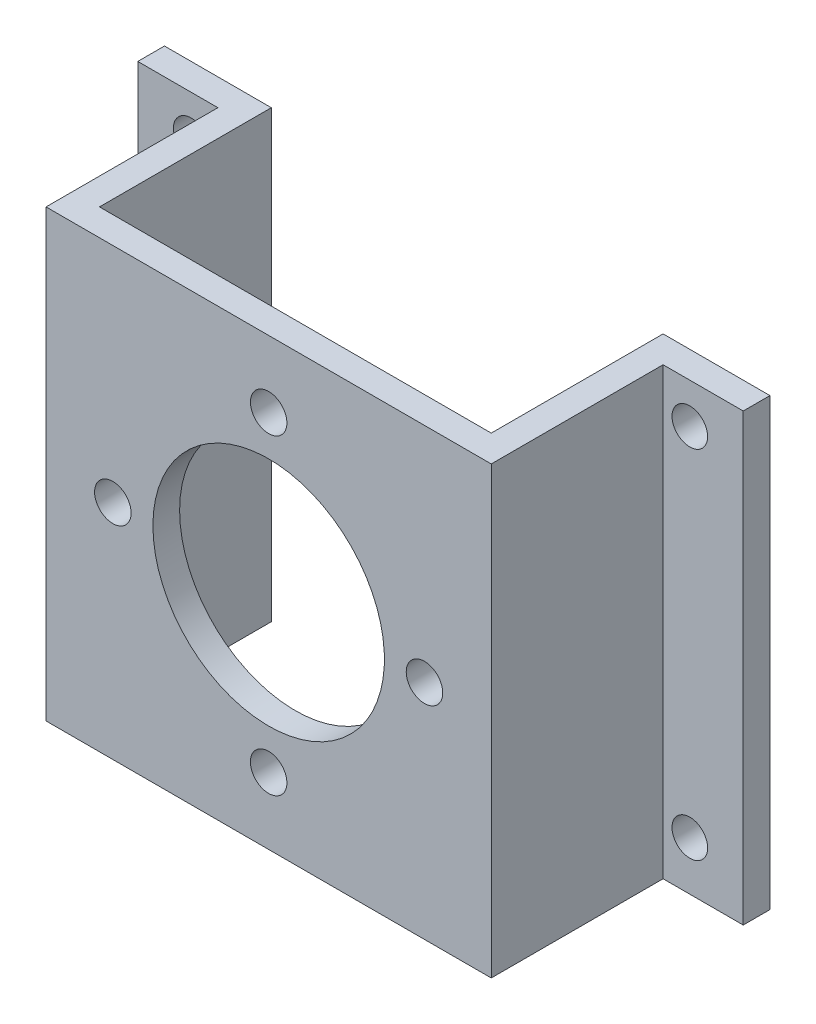
ISO-10303-21;
HEADER;
FILE_DESCRIPTION(('STEP AP214'),'2;1');
FILE_NAME('part.step','',(''),(''),'','','');
FILE_SCHEMA(('AUTOMOTIVE_DESIGN { 1 0 10303 214 1 1 1 1 }'));
ENDSEC;
DATA;
#1=APPLICATION_CONTEXT('core data for automotive mechanical design processes');
#2=APPLICATION_PROTOCOL_DEFINITION('international standard','automotive_design',2000,#1);
#3=PRODUCT_CONTEXT('',#1,'mechanical');
#4=PRODUCT('Part','Part','',(#3));
#5=PRODUCT_RELATED_PRODUCT_CATEGORY('part','',(#4));
#6=PRODUCT_DEFINITION_FORMATION('','',#4);
#7=PRODUCT_DEFINITION_CONTEXT('part definition',#1,'design');
#8=PRODUCT_DEFINITION('design','',#6,#7);
#9=PRODUCT_DEFINITION_SHAPE('','',#8);
#10=(LENGTH_UNIT() NAMED_UNIT(*) SI_UNIT(.MILLI.,.METRE.));
#11=(NAMED_UNIT(*) PLANE_ANGLE_UNIT() SI_UNIT($,.RADIAN.));
#12=(NAMED_UNIT(*) SI_UNIT($,.STERADIAN.) SOLID_ANGLE_UNIT());
#13=UNCERTAINTY_MEASURE_WITH_UNIT(LENGTH_MEASURE(1.E-05),#10,'distance_accuracy_value','');
#14=(GEOMETRIC_REPRESENTATION_CONTEXT(3) GLOBAL_UNCERTAINTY_ASSIGNED_CONTEXT((#13)) GLOBAL_UNIT_ASSIGNED_CONTEXT((#10,
#11,#12)) REPRESENTATION_CONTEXT('',''));
#15=CARTESIAN_POINT('',(0.,0.,0.));
#16=DIRECTION('',(0.,0.,1.));
#17=DIRECTION('',(1.,0.,0.));
#18=AXIS2_PLACEMENT_3D('',#15,#16,#17);
#19=CARTESIAN_POINT('',(-34.,25.,-19.3));
#20=DIRECTION('',(0.,0.,1.));
#21=DIRECTION('',(-1.,0.,0.));
#22=AXIS2_PLACEMENT_3D('',#19,#20,#21);
#23=PLANE('',#22);
#24=CARTESIAN_POINT('',(-28.0000000000001,-19.5,-19.3));
#25=DIRECTION('',(0.,0.,-1.));
#26=DIRECTION('',(-1.,0.,0.));
#27=AXIS2_PLACEMENT_3D('',#24,#25,#26);
#28=CIRCLE('',#27,2.00000000000001);
#29=CARTESIAN_POINT('',(-30.0000000000001,-19.5,-19.3));
#30=VERTEX_POINT('',#29);
#31=EDGE_CURVE('E275',#30,#30,#28,.T.);
#32=ORIENTED_EDGE('',*,*,#31,.F.);
#33=EDGE_LOOP('',(#32));
#34=FACE_BOUND('',#33,.T.);
#35=CARTESIAN_POINT('',(-28.0000000000001,20.5,-19.3));
#36=DIRECTION('',(0.,0.,-1.));
#37=DIRECTION('',(-1.,0.,0.));
#38=AXIS2_PLACEMENT_3D('',#35,#36,#37);
#39=CIRCLE('',#38,2.);
#40=CARTESIAN_POINT('',(-30.0000000000001,20.5,-19.3));
#41=VERTEX_POINT('',#40);
#42=EDGE_CURVE('E278',#41,#41,#39,.T.);
#43=ORIENTED_EDGE('',*,*,#42,.F.);
#44=EDGE_LOOP('',(#43));
#45=FACE_BOUND('',#44,.T.);
#46=DIRECTION('',(1.,0.,0.));
#47=VECTOR('',#46,1.);
#48=CARTESIAN_POINT('',(-34.,-25.,-19.3));
#49=LINE('',#48,#47);
#50=CARTESIAN_POINT('',(-34.,-25.,-19.3));
#51=VERTEX_POINT('',#50);
#52=CARTESIAN_POINT('',(-22.,-25.,-19.3));
#53=VERTEX_POINT('',#52);
#54=EDGE_CURVE('E157',#51,#53,#49,.T.);
#55=ORIENTED_EDGE('',*,*,#54,.F.);
#56=DIRECTION('',(0.,-1.,0.));
#57=VECTOR('',#56,1.);
#58=CARTESIAN_POINT('',(-34.,25.,-19.3));
#59=LINE('',#58,#57);
#60=CARTESIAN_POINT('',(-34.,25.,-19.3));
#61=VERTEX_POINT('',#60);
#62=EDGE_CURVE('E156',#61,#51,#59,.T.);
#63=ORIENTED_EDGE('',*,*,#62,.F.);
#64=DIRECTION('',(1.,0.,0.));
#65=VECTOR('',#64,1.);
#66=CARTESIAN_POINT('',(-34.,25.,-19.3));
#67=LINE('',#66,#65);
#68=CARTESIAN_POINT('',(-22.,25.,-19.3));
#69=VERTEX_POINT('',#68);
#70=EDGE_CURVE('E188',#61,#69,#67,.T.);
#71=ORIENTED_EDGE('',*,*,#70,.T.);
#72=DIRECTION('',(0.,-1.,0.));
#73=VECTOR('',#72,1.);
#74=CARTESIAN_POINT('',(-22.,25.,-19.3));
#75=LINE('',#74,#73);
#76=EDGE_CURVE('E11',#69,#53,#75,.T.);
#77=ORIENTED_EDGE('',*,*,#76,.T.);
#78=EDGE_LOOP('',(#55,#63,#71,#77));
#79=FACE_BOUND('',#78,.T.);
#80=ADVANCED_FACE('F37',(#34,#45,#79),#23,.F.);
#81=CARTESIAN_POINT('',(-22.,25.,-19.3));
#82=DIRECTION('',(-1.,0.,0.));
#83=DIRECTION('',(0.,0.,-1.));
#84=AXIS2_PLACEMENT_3D('',#81,#82,#83);
#85=PLANE('',#84);
#86=DIRECTION('',(0.,0.,1.));
#87=VECTOR('',#86,1.);
#88=CARTESIAN_POINT('',(-22.,-25.,-19.3));
#89=LINE('',#88,#87);
#90=CARTESIAN_POINT('',(-22.,-25.,0.));
#91=VERTEX_POINT('',#90);
#92=EDGE_CURVE('E159',#53,#91,#89,.T.);
#93=ORIENTED_EDGE('',*,*,#92,.F.);
#94=ORIENTED_EDGE('',*,*,#76,.F.);
#95=DIRECTION('',(0.,0.,1.));
#96=VECTOR('',#95,1.);
#97=CARTESIAN_POINT('',(-22.,25.,-19.3));
#98=LINE('',#97,#96);
#99=CARTESIAN_POINT('',(-22.,25.,0.));
#100=VERTEX_POINT('',#99);
#101=EDGE_CURVE('E103',#69,#100,#98,.T.);
#102=ORIENTED_EDGE('',*,*,#101,.T.);
#103=DIRECTION('',(0.,-1.,0.));
#104=VECTOR('',#103,1.);
#105=CARTESIAN_POINT('',(-22.,25.,0.));
#106=LINE('',#105,#104);
#107=EDGE_CURVE('E45',#100,#91,#106,.T.);
#108=ORIENTED_EDGE('',*,*,#107,.T.);
#109=EDGE_LOOP('',(#93,#94,#102,#108));
#110=FACE_BOUND('',#109,.T.);
#111=ADVANCED_FACE('F212',(#110),#85,.F.);
#112=CARTESIAN_POINT('',(-22.,25.,0.));
#113=DIRECTION('',(0.,0.,1.));
#114=DIRECTION('',(-1.,0.,0.));
#115=AXIS2_PLACEMENT_3D('',#112,#113,#114);
#116=PLANE('',#115);
#117=CARTESIAN_POINT('',(0.,-17.5,0.));
#118=DIRECTION('',(0.,0.,-1.));
#119=DIRECTION('',(-1.,0.,0.));
#120=AXIS2_PLACEMENT_3D('',#117,#118,#119);
#121=CIRCLE('',#120,2.05);
#122=CARTESIAN_POINT('',(-2.05,-17.5,0.));
#123=VERTEX_POINT('',#122);
#124=EDGE_CURVE('E308',#123,#123,#121,.T.);
#125=ORIENTED_EDGE('',*,*,#124,.F.);
#126=EDGE_LOOP('',(#125));
#127=FACE_BOUND('',#126,.T.);
#128=CARTESIAN_POINT('',(-17.5,0.,0.));
#129=DIRECTION('',(0.,0.,-1.));
#130=DIRECTION('',(-1.,0.,0.));
#131=AXIS2_PLACEMENT_3D('',#128,#129,#130);
#132=CIRCLE('',#131,2.05);
#133=CARTESIAN_POINT('',(-19.55,0.,0.));
#134=VERTEX_POINT('',#133);
#135=EDGE_CURVE('E305',#134,#134,#132,.T.);
#136=ORIENTED_EDGE('',*,*,#135,.F.);
#137=EDGE_LOOP('',(#136));
#138=FACE_BOUND('',#137,.T.);
#139=CARTESIAN_POINT('',(17.5,0.,0.));
#140=DIRECTION('',(0.,0.,-1.));
#141=DIRECTION('',(-1.,0.,0.));
#142=AXIS2_PLACEMENT_3D('',#139,#140,#141);
#143=CIRCLE('',#142,2.05);
#144=CARTESIAN_POINT('',(15.45,0.,0.));
#145=VERTEX_POINT('',#144);
#146=EDGE_CURVE('E302',#145,#145,#143,.T.);
#147=ORIENTED_EDGE('',*,*,#146,.F.);
#148=EDGE_LOOP('',(#147));
#149=FACE_BOUND('',#148,.T.);
#150=CARTESIAN_POINT('',(0.,17.5,0.));
#151=DIRECTION('',(0.,0.,-1.));
#152=DIRECTION('',(-1.,0.,0.));
#153=AXIS2_PLACEMENT_3D('',#150,#151,#152);
#154=CIRCLE('',#153,2.05);
#155=CARTESIAN_POINT('',(-2.05,17.5,0.));
#156=VERTEX_POINT('',#155);
#157=EDGE_CURVE('E297',#156,#156,#154,.T.);
#158=ORIENTED_EDGE('',*,*,#157,.F.);
#159=EDGE_LOOP('',(#158));
#160=FACE_BOUND('',#159,.T.);
#161=CARTESIAN_POINT('',(0.,0.,0.));
#162=DIRECTION('',(0.,0.,-1.));
#163=DIRECTION('',(-1.,0.,0.));
#164=AXIS2_PLACEMENT_3D('',#161,#162,#163);
#165=CIRCLE('',#164,13.);
#166=CARTESIAN_POINT('',(-13.,0.,0.));
#167=VERTEX_POINT('',#166);
#168=EDGE_CURVE('E160',#167,#167,#165,.T.);
#169=ORIENTED_EDGE('',*,*,#168,.F.);
#170=EDGE_LOOP('',(#169));
#171=FACE_BOUND('',#170,.T.);
#172=DIRECTION('',(1.,0.,0.));
#173=VECTOR('',#172,1.);
#174=CARTESIAN_POINT('',(-22.,-25.,0.));
#175=LINE('',#174,#173);
#176=CARTESIAN_POINT('',(22.,-25.,0.));
#177=VERTEX_POINT('',#176);
#178=EDGE_CURVE('E163',#91,#177,#175,.T.);
#179=ORIENTED_EDGE('',*,*,#178,.F.);
#180=ORIENTED_EDGE('',*,*,#107,.F.);
#181=DIRECTION('',(1.,0.,0.));
#182=VECTOR('',#181,1.);
#183=CARTESIAN_POINT('',(-22.,25.,0.));
#184=LINE('',#183,#182);
#185=CARTESIAN_POINT('',(22.,25.,0.));
#186=VERTEX_POINT('',#185);
#187=EDGE_CURVE('E221',#100,#186,#184,.T.);
#188=ORIENTED_EDGE('',*,*,#187,.T.);
#189=DIRECTION('',(0.,-1.,0.));
#190=VECTOR('',#189,1.);
#191=CARTESIAN_POINT('',(22.,25.,0.));
#192=LINE('',#191,#190);
#193=EDGE_CURVE('E207',#186,#177,#192,.T.);
#194=ORIENTED_EDGE('',*,*,#193,.T.);
#195=EDGE_LOOP('',(#179,#180,#188,#194));
#196=FACE_BOUND('',#195,.T.);
#197=ADVANCED_FACE('F257',(#127,#138,#149,#160,#171,#196),#116,.F.);
#198=CARTESIAN_POINT('',(22.,25.,0.));
#199=DIRECTION('',(1.,0.,0.));
#200=DIRECTION('',(0.,0.,1.));
#201=AXIS2_PLACEMENT_3D('',#198,#199,#200);
#202=PLANE('',#201);
#203=DIRECTION('',(0.,0.,-1.));
#204=VECTOR('',#203,1.);
#205=CARTESIAN_POINT('',(22.,-25.,0.));
#206=LINE('',#205,#204);
#207=CARTESIAN_POINT('',(22.,-25.,-19.3));
#208=VERTEX_POINT('',#207);
#209=EDGE_CURVE('E166',#177,#208,#206,.T.);
#210=ORIENTED_EDGE('',*,*,#209,.F.);
#211=ORIENTED_EDGE('',*,*,#193,.F.);
#212=DIRECTION('',(0.,0.,-1.));
#213=VECTOR('',#212,1.);
#214=CARTESIAN_POINT('',(22.,25.,0.));
#215=LINE('',#214,#213);
#216=CARTESIAN_POINT('',(22.,25.,-19.3));
#217=VERTEX_POINT('',#216);
#218=EDGE_CURVE('E227',#186,#217,#215,.T.);
#219=ORIENTED_EDGE('',*,*,#218,.T.);
#220=DIRECTION('',(0.,-1.,0.));
#221=VECTOR('',#220,1.);
#222=CARTESIAN_POINT('',(22.,25.,-19.3));
#223=LINE('',#222,#221);
#224=EDGE_CURVE('E204',#217,#208,#223,.T.);
#225=ORIENTED_EDGE('',*,*,#224,.T.);
#226=EDGE_LOOP('',(#210,#211,#219,#225));
#227=FACE_BOUND('',#226,.T.);
#228=ADVANCED_FACE('F256',(#227),#202,.F.);
#229=CARTESIAN_POINT('',(22.,25.,-19.3));
#230=DIRECTION('',(0.,0.,1.));
#231=DIRECTION('',(-1.,0.,0.));
#232=AXIS2_PLACEMENT_3D('',#229,#230,#231);
#233=PLANE('',#232);
#234=CARTESIAN_POINT('',(27.9999999999999,20.5,-19.3));
#235=DIRECTION('',(0.,0.,-1.));
#236=DIRECTION('',(-1.,0.,0.));
#237=AXIS2_PLACEMENT_3D('',#234,#235,#236);
#238=CIRCLE('',#237,2.);
#239=CARTESIAN_POINT('',(25.9999999999999,20.5,-19.3));
#240=VERTEX_POINT('',#239);
#241=EDGE_CURVE('E287',#240,#240,#238,.T.);
#242=ORIENTED_EDGE('',*,*,#241,.F.);
#243=EDGE_LOOP('',(#242));
#244=FACE_BOUND('',#243,.T.);
#245=CARTESIAN_POINT('',(27.9999999999999,-19.5,-19.3));
#246=DIRECTION('',(0.,0.,-1.));
#247=DIRECTION('',(-1.,0.,0.));
#248=AXIS2_PLACEMENT_3D('',#245,#246,#247);
#249=CIRCLE('',#248,2.00000000000001);
#250=CARTESIAN_POINT('',(25.9999999999999,-19.5,-19.3));
#251=VERTEX_POINT('',#250);
#252=EDGE_CURVE('E362',#251,#251,#249,.T.);
#253=ORIENTED_EDGE('',*,*,#252,.F.);
#254=EDGE_LOOP('',(#253));
#255=FACE_BOUND('',#254,.T.);
#256=DIRECTION('',(1.,0.,0.));
#257=VECTOR('',#256,1.);
#258=CARTESIAN_POINT('',(22.,-25.,-19.3));
#259=LINE('',#258,#257);
#260=CARTESIAN_POINT('',(34.,-25.,-19.3));
#261=VERTEX_POINT('',#260);
#262=EDGE_CURVE('E169',#208,#261,#259,.T.);
#263=ORIENTED_EDGE('',*,*,#262,.F.);
#264=ORIENTED_EDGE('',*,*,#224,.F.);
#265=DIRECTION('',(1.,0.,0.));
#266=VECTOR('',#265,1.);
#267=CARTESIAN_POINT('',(22.,25.,-19.3));
#268=LINE('',#267,#266);
#269=CARTESIAN_POINT('',(34.,25.,-19.3));
#270=VERTEX_POINT('',#269);
#271=EDGE_CURVE('E230',#217,#270,#268,.T.);
#272=ORIENTED_EDGE('',*,*,#271,.T.);
#273=DIRECTION('',(0.,-1.,0.));
#274=VECTOR('',#273,1.);
#275=CARTESIAN_POINT('',(34.,25.,-19.3));
#276=LINE('',#275,#274);
#277=EDGE_CURVE('E201',#270,#261,#276,.T.);
#278=ORIENTED_EDGE('',*,*,#277,.T.);
#279=EDGE_LOOP('',(#263,#264,#272,#278));
#280=FACE_BOUND('',#279,.T.);
#281=ADVANCED_FACE('F254',(#244,#255,#280),#233,.F.);
#282=CARTESIAN_POINT('',(34.,25.,-16.3));
#283=DIRECTION('',(-1.,0.,0.));
#284=DIRECTION('',(0.,0.,-1.));
#285=AXIS2_PLACEMENT_3D('',#282,#283,#284);
#286=PLANE('',#285);
#287=DIRECTION('',(0.,0.,1.));
#288=VECTOR('',#287,1.);
#289=CARTESIAN_POINT('',(34.,-25.,-16.3));
#290=LINE('',#289,#288);
#291=CARTESIAN_POINT('',(34.,-25.,-16.3));
#292=VERTEX_POINT('',#291);
#293=EDGE_CURVE('E172',#261,#292,#290,.T.);
#294=ORIENTED_EDGE('',*,*,#293,.F.);
#295=ORIENTED_EDGE('',*,*,#277,.F.);
#296=DIRECTION('',(0.,0.,1.));
#297=VECTOR('',#296,1.);
#298=CARTESIAN_POINT('',(34.,25.,-16.3));
#299=LINE('',#298,#297);
#300=CARTESIAN_POINT('',(34.,25.,-16.3));
#301=VERTEX_POINT('',#300);
#302=EDGE_CURVE('E233',#270,#301,#299,.T.);
#303=ORIENTED_EDGE('',*,*,#302,.T.);
#304=DIRECTION('',(0.,-1.,0.));
#305=VECTOR('',#304,1.);
#306=CARTESIAN_POINT('',(34.,25.,-16.3));
#307=LINE('',#306,#305);
#308=EDGE_CURVE('E198',#301,#292,#307,.T.);
#309=ORIENTED_EDGE('',*,*,#308,.T.);
#310=EDGE_LOOP('',(#294,#295,#303,#309));
#311=FACE_BOUND('',#310,.T.);
#312=ADVANCED_FACE('F250',(#311),#286,.F.);
#313=CARTESIAN_POINT('',(25.,25.,-16.3));
#314=DIRECTION('',(0.,0.,-1.));
#315=DIRECTION('',(1.,0.,0.));
#316=AXIS2_PLACEMENT_3D('',#313,#314,#315);
#317=PLANE('',#316);
#318=CARTESIAN_POINT('',(27.9999999999999,20.5,-16.3));
#319=DIRECTION('',(0.,0.,-1.));
#320=DIRECTION('',(-1.,0.,0.));
#321=AXIS2_PLACEMENT_3D('',#318,#319,#320);
#322=CIRCLE('',#321,2.);
#323=CARTESIAN_POINT('',(25.9999999999999,20.5,-16.3));
#324=VERTEX_POINT('',#323);
#325=EDGE_CURVE('E371',#324,#324,#322,.T.);
#326=ORIENTED_EDGE('',*,*,#325,.T.);
#327=EDGE_LOOP('',(#326));
#328=FACE_BOUND('',#327,.T.);
#329=CARTESIAN_POINT('',(27.9999999999999,-19.5,-16.3));
#330=DIRECTION('',(0.,0.,-1.));
#331=DIRECTION('',(-1.,0.,0.));
#332=AXIS2_PLACEMENT_3D('',#329,#330,#331);
#333=CIRCLE('',#332,2.00000000000001);
#334=CARTESIAN_POINT('',(25.9999999999999,-19.5,-16.3));
#335=VERTEX_POINT('',#334);
#336=EDGE_CURVE('E368',#335,#335,#333,.T.);
#337=ORIENTED_EDGE('',*,*,#336,.T.);
#338=EDGE_LOOP('',(#337));
#339=FACE_BOUND('',#338,.T.);
#340=DIRECTION('',(-1.,0.,0.));
#341=VECTOR('',#340,1.);
#342=CARTESIAN_POINT('',(25.,-25.,-16.3));
#343=LINE('',#342,#341);
#344=CARTESIAN_POINT('',(25.,-25.,-16.3));
#345=VERTEX_POINT('',#344);
#346=EDGE_CURVE('E175',#292,#345,#343,.T.);
#347=ORIENTED_EDGE('',*,*,#346,.F.);
#348=ORIENTED_EDGE('',*,*,#308,.F.);
#349=DIRECTION('',(-1.,0.,0.));
#350=VECTOR('',#349,1.);
#351=CARTESIAN_POINT('',(25.,25.,-16.3));
#352=LINE('',#351,#350);
#353=CARTESIAN_POINT('',(25.,25.,-16.3));
#354=VERTEX_POINT('',#353);
#355=EDGE_CURVE('E236',#301,#354,#352,.T.);
#356=ORIENTED_EDGE('',*,*,#355,.T.);
#357=DIRECTION('',(0.,-1.,0.));
#358=VECTOR('',#357,1.);
#359=CARTESIAN_POINT('',(25.,25.,-16.3));
#360=LINE('',#359,#358);
#361=EDGE_CURVE('E195',#354,#345,#360,.T.);
#362=ORIENTED_EDGE('',*,*,#361,.T.);
#363=EDGE_LOOP('',(#347,#348,#356,#362));
#364=FACE_BOUND('',#363,.T.);
#365=ADVANCED_FACE('F247',(#328,#339,#364),#317,.F.);
#366=CARTESIAN_POINT('',(25.,25.,3.));
#367=DIRECTION('',(-1.,0.,0.));
#368=DIRECTION('',(0.,0.,-1.));
#369=AXIS2_PLACEMENT_3D('',#366,#367,#368);
#370=PLANE('',#369);
#371=DIRECTION('',(0.,0.,1.));
#372=VECTOR('',#371,1.);
#373=CARTESIAN_POINT('',(25.,-25.,3.));
#374=LINE('',#373,#372);
#375=CARTESIAN_POINT('',(25.,-25.,3.));
#376=VERTEX_POINT('',#375);
#377=EDGE_CURVE('E178',#345,#376,#374,.T.);
#378=ORIENTED_EDGE('',*,*,#377,.F.);
#379=ORIENTED_EDGE('',*,*,#361,.F.);
#380=DIRECTION('',(0.,0.,1.));
#381=VECTOR('',#380,1.);
#382=CARTESIAN_POINT('',(25.,25.,3.));
#383=LINE('',#382,#381);
#384=CARTESIAN_POINT('',(25.,25.,3.));
#385=VERTEX_POINT('',#384);
#386=EDGE_CURVE('E151',#354,#385,#383,.T.);
#387=ORIENTED_EDGE('',*,*,#386,.T.);
#388=DIRECTION('',(0.,-1.,0.));
#389=VECTOR('',#388,1.);
#390=CARTESIAN_POINT('',(25.,25.,3.));
#391=LINE('',#390,#389);
#392=EDGE_CURVE('E192',#385,#376,#391,.T.);
#393=ORIENTED_EDGE('',*,*,#392,.T.);
#394=EDGE_LOOP('',(#378,#379,#387,#393));
#395=FACE_BOUND('',#394,.T.);
#396=ADVANCED_FACE('F241',(#395),#370,.F.);
#397=CARTESIAN_POINT('',(-25.,25.,3.));
#398=DIRECTION('',(0.,0.,-1.));
#399=DIRECTION('',(1.,0.,0.));
#400=AXIS2_PLACEMENT_3D('',#397,#398,#399);
#401=PLANE('',#400);
#402=CARTESIAN_POINT('',(0.,-17.5,3.));
#403=DIRECTION('',(0.,0.,-1.));
#404=DIRECTION('',(-1.,0.,0.));
#405=AXIS2_PLACEMENT_3D('',#402,#403,#404);
#406=CIRCLE('',#405,2.05);
#407=CARTESIAN_POINT('',(-2.05,-17.5,3.));
#408=VERTEX_POINT('',#407);
#409=EDGE_CURVE('E280',#408,#408,#406,.T.);
#410=ORIENTED_EDGE('',*,*,#409,.T.);
#411=EDGE_LOOP('',(#410));
#412=FACE_BOUND('',#411,.T.);
#413=CARTESIAN_POINT('',(-17.5,0.,3.));
#414=DIRECTION('',(0.,0.,-1.));
#415=DIRECTION('',(-1.,0.,0.));
#416=AXIS2_PLACEMENT_3D('',#413,#414,#415);
#417=CIRCLE('',#416,2.05);
#418=CARTESIAN_POINT('',(-19.55,0.,3.));
#419=VERTEX_POINT('',#418);
#420=EDGE_CURVE('E284',#419,#419,#417,.T.);
#421=ORIENTED_EDGE('',*,*,#420,.T.);
#422=EDGE_LOOP('',(#421));
#423=FACE_BOUND('',#422,.T.);
#424=CARTESIAN_POINT('',(17.5,0.,3.));
#425=DIRECTION('',(0.,0.,-1.));
#426=DIRECTION('',(-1.,0.,0.));
#427=AXIS2_PLACEMENT_3D('',#424,#425,#426);
#428=CIRCLE('',#427,2.05);
#429=CARTESIAN_POINT('',(15.45,0.,3.));
#430=VERTEX_POINT('',#429);
#431=EDGE_CURVE('E292',#430,#430,#428,.T.);
#432=ORIENTED_EDGE('',*,*,#431,.T.);
#433=EDGE_LOOP('',(#432));
#434=FACE_BOUND('',#433,.T.);
#435=CARTESIAN_POINT('',(0.,17.5,3.));
#436=DIRECTION('',(0.,0.,-1.));
#437=DIRECTION('',(-1.,0.,0.));
#438=AXIS2_PLACEMENT_3D('',#435,#436,#437);
#439=CIRCLE('',#438,2.05);
#440=CARTESIAN_POINT('',(-2.05,17.5,3.));
#441=VERTEX_POINT('',#440);
#442=EDGE_CURVE('E294',#441,#441,#439,.T.);
#443=ORIENTED_EDGE('',*,*,#442,.T.);
#444=EDGE_LOOP('',(#443));
#445=FACE_BOUND('',#444,.T.);
#446=CARTESIAN_POINT('',(0.,0.,3.));
#447=DIRECTION('',(0.,0.,-1.));
#448=DIRECTION('',(-1.,0.,0.));
#449=AXIS2_PLACEMENT_3D('',#446,#447,#448);
#450=CIRCLE('',#449,13.);
#451=CARTESIAN_POINT('',(-13.,0.,3.));
#452=VERTEX_POINT('',#451);
#453=EDGE_CURVE('E310',#452,#452,#450,.T.);
#454=ORIENTED_EDGE('',*,*,#453,.T.);
#455=EDGE_LOOP('',(#454));
#456=FACE_BOUND('',#455,.T.);
#457=DIRECTION('',(-1.,0.,0.));
#458=VECTOR('',#457,1.);
#459=CARTESIAN_POINT('',(-25.,-25.,3.));
#460=LINE('',#459,#458);
#461=CARTESIAN_POINT('',(-25.,-25.,3.));
#462=VERTEX_POINT('',#461);
#463=EDGE_CURVE('E181',#376,#462,#460,.T.);
#464=ORIENTED_EDGE('',*,*,#463,.F.);
#465=ORIENTED_EDGE('',*,*,#392,.F.);
#466=DIRECTION('',(-1.,0.,0.));
#467=VECTOR('',#466,1.);
#468=CARTESIAN_POINT('',(-25.,25.,3.));
#469=LINE('',#468,#467);
#470=CARTESIAN_POINT('',(-25.,25.,3.));
#471=VERTEX_POINT('',#470);
#472=EDGE_CURVE('E149',#385,#471,#469,.T.);
#473=ORIENTED_EDGE('',*,*,#472,.T.);
#474=DIRECTION('',(0.,-1.,0.));
#475=VECTOR('',#474,1.);
#476=CARTESIAN_POINT('',(-25.,25.,3.));
#477=LINE('',#476,#475);
#478=EDGE_CURVE('E143',#471,#462,#477,.T.);
#479=ORIENTED_EDGE('',*,*,#478,.T.);
#480=EDGE_LOOP('',(#464,#465,#473,#479));
#481=FACE_BOUND('',#480,.T.);
#482=ADVANCED_FACE('F245',(#412,#423,#434,#445,#456,#481),#401,.F.);
#483=CARTESIAN_POINT('',(-25.,25.,-16.3));
#484=DIRECTION('',(1.,0.,0.));
#485=DIRECTION('',(0.,0.,1.));
#486=AXIS2_PLACEMENT_3D('',#483,#484,#485);
#487=PLANE('',#486);
#488=DIRECTION('',(0.,0.,-1.));
#489=VECTOR('',#488,1.);
#490=CARTESIAN_POINT('',(-25.,-25.,-16.3));
#491=LINE('',#490,#489);
#492=CARTESIAN_POINT('',(-25.,-25.,-16.3));
#493=VERTEX_POINT('',#492);
#494=EDGE_CURVE('E184',#462,#493,#491,.T.);
#495=ORIENTED_EDGE('',*,*,#494,.F.);
#496=ORIENTED_EDGE('',*,*,#478,.F.);
#497=DIRECTION('',(0.,0.,-1.));
#498=VECTOR('',#497,1.);
#499=CARTESIAN_POINT('',(-25.,25.,-16.3));
#500=LINE('',#499,#498);
#501=CARTESIAN_POINT('',(-25.,25.,-16.3));
#502=VERTEX_POINT('',#501);
#503=EDGE_CURVE('E133',#471,#502,#500,.T.);
#504=ORIENTED_EDGE('',*,*,#503,.T.);
#505=DIRECTION('',(0.,-1.,0.));
#506=VECTOR('',#505,1.);
#507=CARTESIAN_POINT('',(-25.,25.,-16.3));
#508=LINE('',#507,#506);
#509=EDGE_CURVE('E138',#502,#493,#508,.T.);
#510=ORIENTED_EDGE('',*,*,#509,.T.);
#511=EDGE_LOOP('',(#495,#496,#504,#510));
#512=FACE_BOUND('',#511,.T.);
#513=ADVANCED_FACE('F146',(#512),#487,.F.);
#514=CARTESIAN_POINT('',(-34.,25.,-16.3));
#515=DIRECTION('',(0.,0.,-1.));
#516=DIRECTION('',(1.,0.,0.));
#517=AXIS2_PLACEMENT_3D('',#514,#515,#516);
#518=PLANE('',#517);
#519=CARTESIAN_POINT('',(-28.0000000000001,-19.5,-16.3));
#520=DIRECTION('',(0.,0.,-1.));
#521=DIRECTION('',(-1.,0.,0.));
#522=AXIS2_PLACEMENT_3D('',#519,#520,#521);
#523=CIRCLE('',#522,2.00000000000001);
#524=CARTESIAN_POINT('',(-30.0000000000001,-19.5,-16.3));
#525=VERTEX_POINT('',#524);
#526=EDGE_CURVE('E365',#525,#525,#523,.T.);
#527=ORIENTED_EDGE('',*,*,#526,.T.);
#528=EDGE_LOOP('',(#527));
#529=FACE_BOUND('',#528,.T.);
#530=CARTESIAN_POINT('',(-28.0000000000001,20.5,-16.3));
#531=DIRECTION('',(0.,0.,-1.));
#532=DIRECTION('',(-1.,0.,0.));
#533=AXIS2_PLACEMENT_3D('',#530,#531,#532);
#534=CIRCLE('',#533,2.);
#535=CARTESIAN_POINT('',(-30.0000000000001,20.5,-16.3));
#536=VERTEX_POINT('',#535);
#537=EDGE_CURVE('E281',#536,#536,#534,.T.);
#538=ORIENTED_EDGE('',*,*,#537,.T.);
#539=EDGE_LOOP('',(#538));
#540=FACE_BOUND('',#539,.T.);
#541=DIRECTION('',(-1.,0.,0.));
#542=VECTOR('',#541,1.);
#543=CARTESIAN_POINT('',(-34.,-25.,-16.3));
#544=LINE('',#543,#542);
#545=CARTESIAN_POINT('',(-34.,-25.,-16.3));
#546=VERTEX_POINT('',#545);
#547=EDGE_CURVE('E140',#493,#546,#544,.T.);
#548=ORIENTED_EDGE('',*,*,#547,.F.);
#549=ORIENTED_EDGE('',*,*,#509,.F.);
#550=DIRECTION('',(-1.,0.,0.));
#551=VECTOR('',#550,1.);
#552=CARTESIAN_POINT('',(-34.,25.,-16.3));
#553=LINE('',#552,#551);
#554=CARTESIAN_POINT('',(-34.,25.,-16.3));
#555=VERTEX_POINT('',#554);
#556=EDGE_CURVE('E129',#502,#555,#553,.T.);
#557=ORIENTED_EDGE('',*,*,#556,.T.);
#558=DIRECTION('',(0.,-1.,0.));
#559=VECTOR('',#558,1.);
#560=CARTESIAN_POINT('',(-34.,25.,-16.3));
#561=LINE('',#560,#559);
#562=EDGE_CURVE('E144',#555,#546,#561,.T.);
#563=ORIENTED_EDGE('',*,*,#562,.T.);
#564=EDGE_LOOP('',(#548,#549,#557,#563));
#565=FACE_BOUND('',#564,.T.);
#566=ADVANCED_FACE('F139',(#529,#540,#565),#518,.F.);
#567=CARTESIAN_POINT('',(-34.,25.,-16.3));
#568=DIRECTION('',(1.,0.,0.));
#569=DIRECTION('',(0.,0.,1.));
#570=AXIS2_PLACEMENT_3D('',#567,#568,#569);
#571=PLANE('',#570);
#572=DIRECTION('',(0.,0.,-1.));
#573=VECTOR('',#572,1.);
#574=CARTESIAN_POINT('',(-34.,-25.,-16.3));
#575=LINE('',#574,#573);
#576=EDGE_CURVE('E91',#546,#51,#575,.T.);
#577=ORIENTED_EDGE('',*,*,#576,.F.);
#578=ORIENTED_EDGE('',*,*,#562,.F.);
#579=DIRECTION('',(0.,0.,-1.));
#580=VECTOR('',#579,1.);
#581=CARTESIAN_POINT('',(-34.,25.,-16.3));
#582=LINE('',#581,#580);
#583=EDGE_CURVE('E53',#555,#61,#582,.T.);
#584=ORIENTED_EDGE('',*,*,#583,.T.);
#585=ORIENTED_EDGE('',*,*,#62,.T.);
#586=EDGE_LOOP('',(#577,#578,#584,#585));
#587=FACE_BOUND('',#586,.T.);
#588=ADVANCED_FACE('F334',(#587),#571,.F.);
#589=CARTESIAN_POINT('',(0.,25.,0.));
#590=DIRECTION('',(0.,1.,0.));
#591=DIRECTION('',(0.,0.,-1.));
#592=AXIS2_PLACEMENT_3D('',#589,#590,#591);
#593=PLANE('',#592);
#594=ORIENTED_EDGE('',*,*,#70,.F.);
#595=ORIENTED_EDGE('',*,*,#583,.F.);
#596=ORIENTED_EDGE('',*,*,#556,.F.);
#597=ORIENTED_EDGE('',*,*,#503,.F.);
#598=ORIENTED_EDGE('',*,*,#472,.F.);
#599=ORIENTED_EDGE('',*,*,#386,.F.);
#600=ORIENTED_EDGE('',*,*,#355,.F.);
#601=ORIENTED_EDGE('',*,*,#302,.F.);
#602=ORIENTED_EDGE('',*,*,#271,.F.);
#603=ORIENTED_EDGE('',*,*,#218,.F.);
#604=ORIENTED_EDGE('',*,*,#187,.F.);
#605=ORIENTED_EDGE('',*,*,#101,.F.);
#606=EDGE_LOOP('',(#594,#595,#596,#597,#598,#599,#600,#601,#602,#603,#604,#605));
#607=FACE_BOUND('',#606,.T.);
#608=ADVANCED_FACE('F131',(#607),#593,.T.);
#609=CARTESIAN_POINT('',(0.,-25.,0.));
#610=DIRECTION('',(0.,1.,0.));
#611=DIRECTION('',(0.,0.,-1.));
#612=AXIS2_PLACEMENT_3D('',#609,#610,#611);
#613=PLANE('',#612);
#614=ORIENTED_EDGE('',*,*,#54,.T.);
#615=ORIENTED_EDGE('',*,*,#92,.T.);
#616=ORIENTED_EDGE('',*,*,#178,.T.);
#617=ORIENTED_EDGE('',*,*,#209,.T.);
#618=ORIENTED_EDGE('',*,*,#262,.T.);
#619=ORIENTED_EDGE('',*,*,#293,.T.);
#620=ORIENTED_EDGE('',*,*,#346,.T.);
#621=ORIENTED_EDGE('',*,*,#377,.T.);
#622=ORIENTED_EDGE('',*,*,#463,.T.);
#623=ORIENTED_EDGE('',*,*,#494,.T.);
#624=ORIENTED_EDGE('',*,*,#547,.T.);
#625=ORIENTED_EDGE('',*,*,#576,.T.);
#626=EDGE_LOOP('',(#614,#615,#616,#617,#618,#619,#620,#621,#622,#623,#624,#625));
#627=FACE_BOUND('',#626,.T.);
#628=ADVANCED_FACE('F215',(#627),#613,.F.);
#629=CARTESIAN_POINT('',(0.,0.,-47.));
#630=DIRECTION('',(0.,0.,1.));
#631=DIRECTION('',(-1.,0.,0.));
#632=AXIS2_PLACEMENT_3D('',#629,#630,#631);
#633=CYLINDRICAL_SURFACE('',#632,13.);
#634=ORIENTED_EDGE('',*,*,#453,.F.);
#635=EDGE_LOOP('',(#634));
#636=FACE_BOUND('',#635,.T.);
#637=ORIENTED_EDGE('',*,*,#168,.T.);
#638=EDGE_LOOP('',(#637));
#639=FACE_BOUND('',#638,.T.);
#640=ADVANCED_FACE('F317',(#636,#639),#633,.F.);
#641=CARTESIAN_POINT('',(0.,17.5,-47.));
#642=DIRECTION('',(0.,0.,1.));
#643=DIRECTION('',(-1.,0.,0.));
#644=AXIS2_PLACEMENT_3D('',#641,#642,#643);
#645=CYLINDRICAL_SURFACE('',#644,2.05);
#646=ORIENTED_EDGE('',*,*,#442,.F.);
#647=EDGE_LOOP('',(#646));
#648=FACE_BOUND('',#647,.T.);
#649=ORIENTED_EDGE('',*,*,#157,.T.);
#650=EDGE_LOOP('',(#649));
#651=FACE_BOUND('',#650,.T.);
#652=ADVANCED_FACE('F320',(#648,#651),#645,.F.);
#653=CARTESIAN_POINT('',(17.5,0.,-47.));
#654=DIRECTION('',(0.,0.,1.));
#655=DIRECTION('',(-1.,0.,0.));
#656=AXIS2_PLACEMENT_3D('',#653,#654,#655);
#657=CYLINDRICAL_SURFACE('',#656,2.05);
#658=ORIENTED_EDGE('',*,*,#431,.F.);
#659=EDGE_LOOP('',(#658));
#660=FACE_BOUND('',#659,.T.);
#661=ORIENTED_EDGE('',*,*,#146,.T.);
#662=EDGE_LOOP('',(#661));
#663=FACE_BOUND('',#662,.T.);
#664=ADVANCED_FACE('F327',(#660,#663),#657,.F.);
#665=CARTESIAN_POINT('',(-17.5,0.,-47.));
#666=DIRECTION('',(0.,0.,1.));
#667=DIRECTION('',(-1.,0.,0.));
#668=AXIS2_PLACEMENT_3D('',#665,#666,#667);
#669=CYLINDRICAL_SURFACE('',#668,2.05);
#670=ORIENTED_EDGE('',*,*,#420,.F.);
#671=EDGE_LOOP('',(#670));
#672=FACE_BOUND('',#671,.T.);
#673=ORIENTED_EDGE('',*,*,#135,.T.);
#674=EDGE_LOOP('',(#673));
#675=FACE_BOUND('',#674,.T.);
#676=ADVANCED_FACE('F398',(#672,#675),#669,.F.);
#677=CARTESIAN_POINT('',(0.,-17.5,-47.));
#678=DIRECTION('',(0.,0.,1.));
#679=DIRECTION('',(-1.,0.,0.));
#680=AXIS2_PLACEMENT_3D('',#677,#678,#679);
#681=CYLINDRICAL_SURFACE('',#680,2.05);
#682=ORIENTED_EDGE('',*,*,#409,.F.);
#683=EDGE_LOOP('',(#682));
#684=FACE_BOUND('',#683,.T.);
#685=ORIENTED_EDGE('',*,*,#124,.T.);
#686=EDGE_LOOP('',(#685));
#687=FACE_BOUND('',#686,.T.);
#688=ADVANCED_FACE('F391',(#684,#687),#681,.F.);
#689=CARTESIAN_POINT('',(-28.0000000000001,20.5,-26.3));
#690=DIRECTION('',(0.,0.,1.));
#691=DIRECTION('',(-1.,0.,0.));
#692=AXIS2_PLACEMENT_3D('',#689,#690,#691);
#693=CYLINDRICAL_SURFACE('',#692,2.);
#694=ORIENTED_EDGE('',*,*,#537,.F.);
#695=EDGE_LOOP('',(#694));
#696=FACE_BOUND('',#695,.T.);
#697=ORIENTED_EDGE('',*,*,#42,.T.);
#698=EDGE_LOOP('',(#697));
#699=FACE_BOUND('',#698,.T.);
#700=ADVANCED_FACE('F382',(#696,#699),#693,.F.);
#701=CARTESIAN_POINT('',(-28.0000000000001,-19.5,-26.3));
#702=DIRECTION('',(0.,0.,1.));
#703=DIRECTION('',(-1.,0.,0.));
#704=AXIS2_PLACEMENT_3D('',#701,#702,#703);
#705=CYLINDRICAL_SURFACE('',#704,2.00000000000001);
#706=ORIENTED_EDGE('',*,*,#526,.F.);
#707=EDGE_LOOP('',(#706));
#708=FACE_BOUND('',#707,.T.);
#709=ORIENTED_EDGE('',*,*,#31,.T.);
#710=EDGE_LOOP('',(#709));
#711=FACE_BOUND('',#710,.T.);
#712=ADVANCED_FACE('F378',(#708,#711),#705,.F.);
#713=CARTESIAN_POINT('',(27.9999999999999,-19.5,-26.3));
#714=DIRECTION('',(0.,0.,1.));
#715=DIRECTION('',(-1.,0.,0.));
#716=AXIS2_PLACEMENT_3D('',#713,#714,#715);
#717=CYLINDRICAL_SURFACE('',#716,2.00000000000001);
#718=ORIENTED_EDGE('',*,*,#336,.F.);
#719=EDGE_LOOP('',(#718));
#720=FACE_BOUND('',#719,.T.);
#721=ORIENTED_EDGE('',*,*,#252,.T.);
#722=EDGE_LOOP('',(#721));
#723=FACE_BOUND('',#722,.T.);
#724=ADVANCED_FACE('F381',(#720,#723),#717,.F.);
#725=CARTESIAN_POINT('',(27.9999999999999,20.5,-26.3));
#726=DIRECTION('',(0.,0.,1.));
#727=DIRECTION('',(-1.,0.,0.));
#728=AXIS2_PLACEMENT_3D('',#725,#726,#727);
#729=CYLINDRICAL_SURFACE('',#728,2.);
#730=ORIENTED_EDGE('',*,*,#325,.F.);
#731=EDGE_LOOP('',(#730));
#732=FACE_BOUND('',#731,.T.);
#733=ORIENTED_EDGE('',*,*,#241,.T.);
#734=EDGE_LOOP('',(#733));
#735=FACE_BOUND('',#734,.T.);
#736=ADVANCED_FACE('F388',(#732,#735),#729,.F.);
#737=CLOSED_SHELL('',(#80,#111,#197,#228,#281,#312,#365,#396,#482,#513,#566,#588,#608,#628,#640,
#652,#664,#676,#688,#700,#712,#724,#736));
#738=MANIFOLD_SOLID_BREP('B2',#737);
#739=ADVANCED_BREP_SHAPE_REPRESENTATION('',(#18,#738),#14);
#740=SHAPE_DEFINITION_REPRESENTATION(#9,#739);
ENDSEC;
END-ISO-10303-21;
